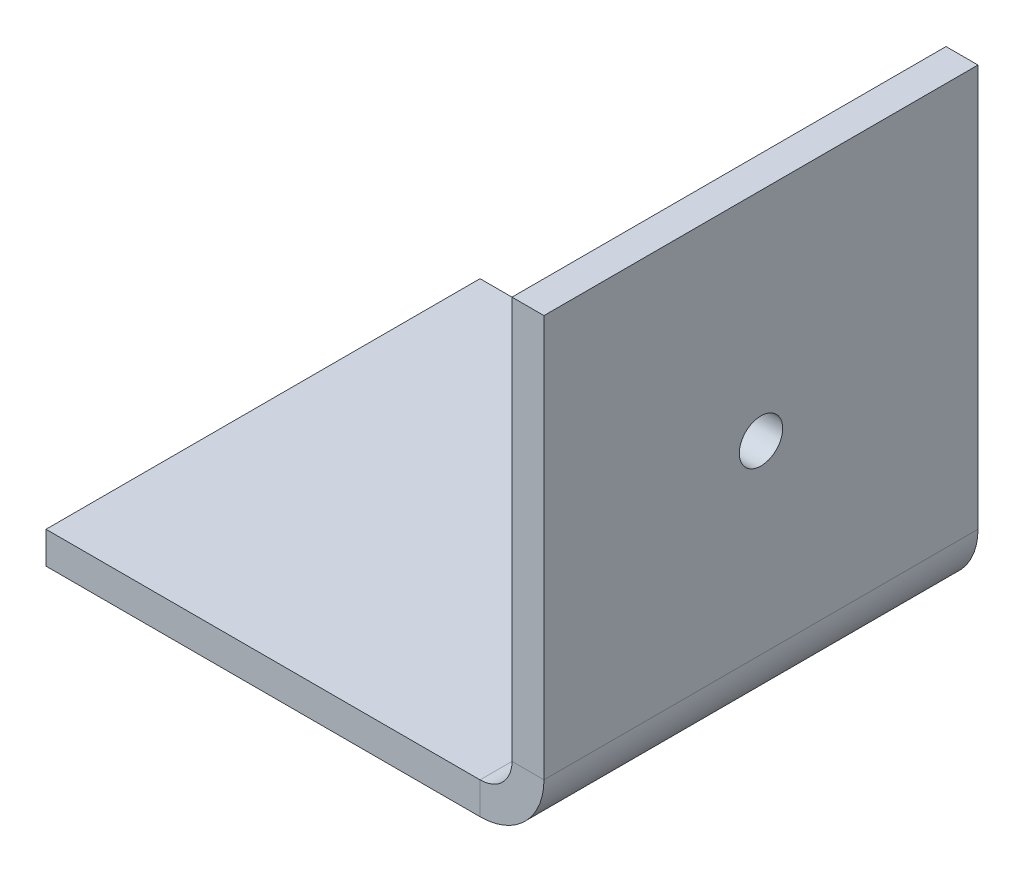
ISO-10303-21;
HEADER;
FILE_DESCRIPTION(('STEP AP214'),'2;1');
FILE_NAME('part.step','',(''),(''),'','','');
FILE_SCHEMA(('AUTOMOTIVE_DESIGN { 1 0 10303 214 1 1 1 1 }'));
ENDSEC;
DATA;
#1=APPLICATION_CONTEXT('core data for automotive mechanical design processes');
#2=APPLICATION_PROTOCOL_DEFINITION('international standard','automotive_design',2000,#1);
#3=PRODUCT_CONTEXT('',#1,'mechanical');
#4=PRODUCT('Part','Part','',(#3));
#5=PRODUCT_RELATED_PRODUCT_CATEGORY('part','',(#4));
#6=PRODUCT_DEFINITION_FORMATION('','',#4);
#7=PRODUCT_DEFINITION_CONTEXT('part definition',#1,'design');
#8=PRODUCT_DEFINITION('design','',#6,#7);
#9=PRODUCT_DEFINITION_SHAPE('','',#8);
#10=(LENGTH_UNIT() NAMED_UNIT(*) SI_UNIT(.MILLI.,.METRE.));
#11=(NAMED_UNIT(*) PLANE_ANGLE_UNIT() SI_UNIT($,.RADIAN.));
#12=(NAMED_UNIT(*) SI_UNIT($,.STERADIAN.) SOLID_ANGLE_UNIT());
#13=UNCERTAINTY_MEASURE_WITH_UNIT(LENGTH_MEASURE(1.E-05),#10,'distance_accuracy_value','');
#14=(GEOMETRIC_REPRESENTATION_CONTEXT(3) GLOBAL_UNCERTAINTY_ASSIGNED_CONTEXT((#13)) GLOBAL_UNIT_ASSIGNED_CONTEXT((#10,
#11,#12)) REPRESENTATION_CONTEXT('',''));
#15=CARTESIAN_POINT('',(0.,0.,0.));
#16=DIRECTION('',(0.,0.,1.));
#17=DIRECTION('',(1.,0.,0.));
#18=AXIS2_PLACEMENT_3D('',#15,#16,#17);
#19=CARTESIAN_POINT('',(-5.,-0.7366,5.));
#20=DIRECTION('',(0.,0.,1.));
#21=DIRECTION('',(1.,0.,0.));
#22=AXIS2_PLACEMENT_3D('',#19,#20,#21);
#23=PLANE('',#22);
#24=DIRECTION('',(1.,0.,0.));
#25=VECTOR('',#24,1.);
#26=CARTESIAN_POINT('',(-5.,0.,5.));
#27=LINE('',#26,#25);
#28=CARTESIAN_POINT('',(-5.,0.,5.));
#29=VERTEX_POINT('',#28);
#30=CARTESIAN_POINT('',(4.99999999999999,0.,5.));
#31=VERTEX_POINT('',#30);
#32=EDGE_CURVE('E192',#29,#31,#27,.T.);
#33=ORIENTED_EDGE('',*,*,#32,.F.);
#34=DIRECTION('',(0.,1.,0.));
#35=VECTOR('',#34,1.);
#36=CARTESIAN_POINT('',(-5.,-0.7366,5.));
#37=LINE('',#36,#35);
#38=CARTESIAN_POINT('',(-5.,-0.7366,5.));
#39=VERTEX_POINT('',#38);
#40=EDGE_CURVE('E67',#39,#29,#37,.T.);
#41=ORIENTED_EDGE('',*,*,#40,.F.);
#42=DIRECTION('',(1.,0.,0.));
#43=VECTOR('',#42,1.);
#44=CARTESIAN_POINT('',(-5.,-0.7366,5.));
#45=LINE('',#44,#43);
#46=CARTESIAN_POINT('',(4.99999999999999,-0.7366,5.));
#47=VERTEX_POINT('',#46);
#48=EDGE_CURVE('E197',#39,#47,#45,.T.);
#49=ORIENTED_EDGE('',*,*,#48,.T.);
#50=DIRECTION('',(0.,1.,0.));
#51=VECTOR('',#50,1.);
#52=CARTESIAN_POINT('',(4.99999999999999,-0.7366,5.));
#53=LINE('',#52,#51);
#54=EDGE_CURVE('E13',#47,#31,#53,.T.);
#55=ORIENTED_EDGE('',*,*,#54,.T.);
#56=EDGE_LOOP('',(#33,#41,#49,#55));
#57=FACE_BOUND('',#56,.T.);
#58=ADVANCED_FACE('F57',(#57),#23,.T.);
#59=CARTESIAN_POINT('',(-5.00000000000001,-0.7366,-5.));
#60=DIRECTION('',(-1.,0.,0.));
#61=DIRECTION('',(0.,0.,1.));
#62=AXIS2_PLACEMENT_3D('',#59,#60,#61);
#63=PLANE('',#62);
#64=DIRECTION('',(0.,0.,1.));
#65=VECTOR('',#64,1.);
#66=CARTESIAN_POINT('',(-5.00000000000001,0.,-5.));
#67=LINE('',#66,#65);
#68=CARTESIAN_POINT('',(-5.00000000000001,0.,-5.));
#69=VERTEX_POINT('',#68);
#70=EDGE_CURVE('E204',#69,#29,#67,.T.);
#71=ORIENTED_EDGE('',*,*,#70,.F.);
#72=DIRECTION('',(0.,1.,0.));
#73=VECTOR('',#72,1.);
#74=CARTESIAN_POINT('',(-5.00000000000001,-0.7366,-5.));
#75=LINE('',#74,#73);
#76=CARTESIAN_POINT('',(-5.00000000000001,-0.7366,-5.));
#77=VERTEX_POINT('',#76);
#78=EDGE_CURVE('E100',#77,#69,#75,.T.);
#79=ORIENTED_EDGE('',*,*,#78,.F.);
#80=DIRECTION('',(0.,0.,1.));
#81=VECTOR('',#80,1.);
#82=CARTESIAN_POINT('',(-5.00000000000001,-0.7366,-5.));
#83=LINE('',#82,#81);
#84=EDGE_CURVE('E195',#77,#39,#83,.T.);
#85=ORIENTED_EDGE('',*,*,#84,.T.);
#86=ORIENTED_EDGE('',*,*,#40,.T.);
#87=EDGE_LOOP('',(#71,#79,#85,#86));
#88=FACE_BOUND('',#87,.T.);
#89=ADVANCED_FACE('F243',(#88),#63,.T.);
#90=CARTESIAN_POINT('',(-5.00000000000001,-0.7366,-5.));
#91=DIRECTION('',(0.,0.,-1.));
#92=DIRECTION('',(-1.,0.,0.));
#93=AXIS2_PLACEMENT_3D('',#90,#91,#92);
#94=PLANE('',#93);
#95=DIRECTION('',(-1.,0.,0.));
#96=VECTOR('',#95,1.);
#97=CARTESIAN_POINT('',(-5.00000000000001,0.,-5.));
#98=LINE('',#97,#96);
#99=CARTESIAN_POINT('',(4.99999999999998,0.,-5.));
#100=VERTEX_POINT('',#99);
#101=EDGE_CURVE('E201',#100,#69,#98,.T.);
#102=ORIENTED_EDGE('',*,*,#101,.F.);
#103=DIRECTION('',(0.,1.,0.));
#104=VECTOR('',#103,1.);
#105=CARTESIAN_POINT('',(4.99999999999998,-0.7366,-5.));
#106=LINE('',#105,#104);
#107=CARTESIAN_POINT('',(4.99999999999998,-0.736600000000003,-5.));
#108=VERTEX_POINT('',#107);
#109=EDGE_CURVE('E61',#108,#100,#106,.T.);
#110=ORIENTED_EDGE('',*,*,#109,.F.);
#111=DIRECTION('',(-1.,0.,0.));
#112=VECTOR('',#111,1.);
#113=CARTESIAN_POINT('',(-5.00000000000001,-0.7366,-5.));
#114=LINE('',#113,#112);
#115=EDGE_CURVE('E191',#108,#77,#114,.T.);
#116=ORIENTED_EDGE('',*,*,#115,.T.);
#117=ORIENTED_EDGE('',*,*,#78,.T.);
#118=EDGE_LOOP('',(#102,#110,#116,#117));
#119=FACE_BOUND('',#118,.T.);
#120=ADVANCED_FACE('F59',(#119),#94,.T.);
#121=CARTESIAN_POINT('',(0.,-0.7366,0.));
#122=DIRECTION('',(0.,1.,0.));
#123=DIRECTION('',(0.,0.,1.));
#124=AXIS2_PLACEMENT_3D('',#121,#122,#123);
#125=PLANE('',#124);
#126=DIRECTION('',(0.,0.,-1.));
#127=VECTOR('',#126,1.);
#128=CARTESIAN_POINT('',(4.99999999999998,-0.7366,-5.));
#129=LINE('',#128,#127);
#130=EDGE_CURVE('E76',#47,#108,#129,.T.);
#131=ORIENTED_EDGE('',*,*,#130,.F.);
#132=ORIENTED_EDGE('',*,*,#48,.F.);
#133=ORIENTED_EDGE('',*,*,#84,.F.);
#134=ORIENTED_EDGE('',*,*,#115,.F.);
#135=EDGE_LOOP('',(#131,#132,#133,#134));
#136=FACE_BOUND('',#135,.T.);
#137=ADVANCED_FACE('F238',(#136),#125,.F.);
#138=CARTESIAN_POINT('',(0.,0.,0.));
#139=DIRECTION('',(0.,1.,0.));
#140=DIRECTION('',(0.,0.,1.));
#141=AXIS2_PLACEMENT_3D('',#138,#139,#140);
#142=PLANE('',#141);
#143=DIRECTION('',(0.,0.,-1.));
#144=VECTOR('',#143,1.);
#145=CARTESIAN_POINT('',(4.99999999999998,0.,-5.));
#146=LINE('',#145,#144);
#147=EDGE_CURVE('E180',#31,#100,#146,.T.);
#148=ORIENTED_EDGE('',*,*,#147,.T.);
#149=ORIENTED_EDGE('',*,*,#101,.T.);
#150=ORIENTED_EDGE('',*,*,#70,.T.);
#151=ORIENTED_EDGE('',*,*,#32,.T.);
#152=EDGE_LOOP('',(#148,#149,#150,#151));
#153=FACE_BOUND('',#152,.T.);
#154=ADVANCED_FACE('F231',(#153),#142,.T.);
#155=CARTESIAN_POINT('',(4.99999999999999,0.7366,5.));
#156=DIRECTION('',(0.,0.,1.));
#157=DIRECTION('',(1.,0.,0.));
#158=AXIS2_PLACEMENT_3D('',#155,#156,#157);
#159=PLANE('',#158);
#160=DIRECTION('',(-1.,0.,0.));
#161=VECTOR('',#160,1.);
#162=CARTESIAN_POINT('',(6.47319999999999,0.736599999999994,5.));
#163=LINE('',#162,#161);
#164=CARTESIAN_POINT('',(5.73659999999999,0.736599999999997,5.));
#165=VERTEX_POINT('',#164);
#166=CARTESIAN_POINT('',(6.47319999999999,0.736599999999994,5.));
#167=VERTEX_POINT('',#166);
#168=EDGE_CURVE('E154',#165,#167,#163,.F.);
#169=ORIENTED_EDGE('',*,*,#168,.F.);
#170=CARTESIAN_POINT('',(4.99999999999999,0.7366,5.));
#171=DIRECTION('',(0.,0.,-1.));
#172=DIRECTION('',(-1.,0.,0.));
#173=AXIS2_PLACEMENT_3D('',#170,#171,#172);
#174=CIRCLE('',#173,0.736600000000003);
#175=EDGE_CURVE('E184',#31,#165,#174,.F.);
#176=ORIENTED_EDGE('',*,*,#175,.F.);
#177=ORIENTED_EDGE('',*,*,#54,.F.);
#178=CARTESIAN_POINT('',(4.99999999999999,0.7366,5.));
#179=DIRECTION('',(0.,0.,-1.));
#180=DIRECTION('',(-1.,0.,0.));
#181=AXIS2_PLACEMENT_3D('',#178,#179,#180);
#182=CIRCLE('',#181,1.4732);
#183=EDGE_CURVE('E177',#47,#167,#182,.F.);
#184=ORIENTED_EDGE('',*,*,#183,.T.);
#185=EDGE_LOOP('',(#169,#176,#177,#184));
#186=FACE_BOUND('',#185,.T.);
#187=ADVANCED_FACE('F229',(#186),#159,.T.);
#188=CARTESIAN_POINT('',(4.99999999999999,0.7366,-5.));
#189=DIRECTION('',(0.,0.,1.));
#190=DIRECTION('',(1.,0.,0.));
#191=AXIS2_PLACEMENT_3D('',#188,#189,#190);
#192=PLANE('',#191);
#193=CARTESIAN_POINT('',(4.99999999999999,0.7366,-5.));
#194=DIRECTION('',(0.,0.,-1.));
#195=DIRECTION('',(-1.,0.,0.));
#196=AXIS2_PLACEMENT_3D('',#193,#194,#195);
#197=CIRCLE('',#196,0.736600000000003);
#198=CARTESIAN_POINT('',(5.73659999999999,0.736599999999997,-5.));
#199=VERTEX_POINT('',#198);
#200=EDGE_CURVE('E187',#199,#100,#197,.T.);
#201=ORIENTED_EDGE('',*,*,#200,.F.);
#202=DIRECTION('',(-1.,0.,0.));
#203=VECTOR('',#202,1.);
#204=CARTESIAN_POINT('',(5.73659999999998,0.736599999999997,-5.));
#205=LINE('',#204,#203);
#206=CARTESIAN_POINT('',(6.47319999999998,0.736599999999994,-5.));
#207=VERTEX_POINT('',#206);
#208=EDGE_CURVE('E171',#199,#207,#205,.F.);
#209=ORIENTED_EDGE('',*,*,#208,.T.);
#210=CARTESIAN_POINT('',(4.99999999999999,0.7366,-5.));
#211=DIRECTION('',(0.,0.,-1.));
#212=DIRECTION('',(-1.,0.,0.));
#213=AXIS2_PLACEMENT_3D('',#210,#211,#212);
#214=CIRCLE('',#213,1.4732);
#215=EDGE_CURVE('E181',#207,#108,#214,.T.);
#216=ORIENTED_EDGE('',*,*,#215,.T.);
#217=ORIENTED_EDGE('',*,*,#109,.T.);
#218=EDGE_LOOP('',(#201,#209,#216,#217));
#219=FACE_BOUND('',#218,.T.);
#220=ADVANCED_FACE('F212',(#219),#192,.F.);
#221=CARTESIAN_POINT('',(4.99999999999999,0.7366,-5.));
#222=DIRECTION('',(0.,0.,-1.));
#223=DIRECTION('',(1.,0.,0.));
#224=AXIS2_PLACEMENT_3D('',#221,#222,#223);
#225=CYLINDRICAL_SURFACE('',#224,1.4732);
#226=ORIENTED_EDGE('',*,*,#130,.T.);
#227=ORIENTED_EDGE('',*,*,#215,.F.);
#228=DIRECTION('',(0.,0.,-1.));
#229=VECTOR('',#228,1.);
#230=CARTESIAN_POINT('',(6.47319999999999,0.736599999999994,5.));
#231=LINE('',#230,#229);
#232=EDGE_CURVE('E169',#207,#167,#231,.F.);
#233=ORIENTED_EDGE('',*,*,#232,.T.);
#234=ORIENTED_EDGE('',*,*,#183,.F.);
#235=EDGE_LOOP('',(#226,#227,#233,#234));
#236=FACE_BOUND('',#235,.T.);
#237=ADVANCED_FACE('F227',(#236),#225,.T.);
#238=CARTESIAN_POINT('',(4.99999999999999,0.7366,-5.));
#239=DIRECTION('',(0.,0.,-1.));
#240=DIRECTION('',(1.,0.,0.));
#241=AXIS2_PLACEMENT_3D('',#238,#239,#240);
#242=CYLINDRICAL_SURFACE('',#241,0.736600000000003);
#243=ORIENTED_EDGE('',*,*,#147,.F.);
#244=ORIENTED_EDGE('',*,*,#175,.T.);
#245=DIRECTION('',(0.,0.,-1.));
#246=VECTOR('',#245,1.);
#247=CARTESIAN_POINT('',(5.73659999999999,0.736599999999997,5.));
#248=LINE('',#247,#246);
#249=EDGE_CURVE('E174',#165,#199,#248,.T.);
#250=ORIENTED_EDGE('',*,*,#249,.T.);
#251=ORIENTED_EDGE('',*,*,#200,.T.);
#252=EDGE_LOOP('',(#243,#244,#250,#251));
#253=FACE_BOUND('',#252,.T.);
#254=ADVANCED_FACE('F216',(#253),#242,.F.);
#255=CARTESIAN_POINT('',(6.47319999999998,0.,0.));
#256=DIRECTION('',(-1.,0.,0.));
#257=DIRECTION('',(0.,-1.,0.));
#258=AXIS2_PLACEMENT_3D('',#255,#256,#257);
#259=PLANE('',#258);
#260=CARTESIAN_POINT('',(6.4732,5.,0.));
#261=DIRECTION('',(-1.,0.,0.));
#262=DIRECTION('',(0.,-1.,0.));
#263=AXIS2_PLACEMENT_3D('',#260,#261,#262);
#264=CIRCLE('',#263,0.5);
#265=CARTESIAN_POINT('',(6.4732,4.5,0.));
#266=VERTEX_POINT('',#265);
#267=EDGE_CURVE('E163',#266,#266,#264,.F.);
#268=ORIENTED_EDGE('',*,*,#267,.F.);
#269=EDGE_LOOP('',(#268));
#270=FACE_BOUND('',#269,.T.);
#271=ORIENTED_EDGE('',*,*,#232,.F.);
#272=DIRECTION('',(0.,1.,0.));
#273=VECTOR('',#272,1.);
#274=CARTESIAN_POINT('',(6.47319999999998,0.,-5.));
#275=LINE('',#274,#273);
#276=CARTESIAN_POINT('',(6.47320000000002,10.,-5.));
#277=VERTEX_POINT('',#276);
#278=EDGE_CURVE('E137',#207,#277,#275,.T.);
#279=ORIENTED_EDGE('',*,*,#278,.T.);
#280=DIRECTION('',(0.,0.,1.));
#281=VECTOR('',#280,1.);
#282=CARTESIAN_POINT('',(6.47320000000002,10.,0.));
#283=LINE('',#282,#281);
#284=CARTESIAN_POINT('',(6.47320000000002,10.,5.));
#285=VERTEX_POINT('',#284);
#286=EDGE_CURVE('E130',#277,#285,#283,.T.);
#287=ORIENTED_EDGE('',*,*,#286,.T.);
#288=DIRECTION('',(0.,-1.,0.));
#289=VECTOR('',#288,1.);
#290=CARTESIAN_POINT('',(6.47319999999999,0.,5.));
#291=LINE('',#290,#289);
#292=EDGE_CURVE('E135',#285,#167,#291,.T.);
#293=ORIENTED_EDGE('',*,*,#292,.T.);
#294=EDGE_LOOP('',(#271,#279,#287,#293));
#295=FACE_BOUND('',#294,.T.);
#296=ADVANCED_FACE('F133',(#270,#295),#259,.F.);
#297=CARTESIAN_POINT('',(5.73659999999998,0.,0.));
#298=DIRECTION('',(-1.,0.,0.));
#299=DIRECTION('',(0.,-1.,0.));
#300=AXIS2_PLACEMENT_3D('',#297,#298,#299);
#301=PLANE('',#300);
#302=CARTESIAN_POINT('',(5.7366,5.,0.));
#303=DIRECTION('',(-1.,0.,0.));
#304=DIRECTION('',(0.,-1.,0.));
#305=AXIS2_PLACEMENT_3D('',#302,#303,#304);
#306=CIRCLE('',#305,0.5);
#307=CARTESIAN_POINT('',(5.7366,4.5,0.));
#308=VERTEX_POINT('',#307);
#309=EDGE_CURVE('E166',#308,#308,#306,.F.);
#310=ORIENTED_EDGE('',*,*,#309,.T.);
#311=EDGE_LOOP('',(#310));
#312=FACE_BOUND('',#311,.T.);
#313=DIRECTION('',(0.,-1.,0.));
#314=VECTOR('',#313,1.);
#315=CARTESIAN_POINT('',(5.73660000000002,10.,-5.));
#316=LINE('',#315,#314);
#317=CARTESIAN_POINT('',(5.73660000000002,10.,-5.));
#318=VERTEX_POINT('',#317);
#319=EDGE_CURVE('E157',#199,#318,#316,.F.);
#320=ORIENTED_EDGE('',*,*,#319,.F.);
#321=ORIENTED_EDGE('',*,*,#249,.F.);
#322=DIRECTION('',(0.,1.,0.));
#323=VECTOR('',#322,1.);
#324=CARTESIAN_POINT('',(5.73659999999999,0.,5.));
#325=LINE('',#324,#323);
#326=CARTESIAN_POINT('',(5.73660000000002,10.,5.));
#327=VERTEX_POINT('',#326);
#328=EDGE_CURVE('E161',#327,#165,#325,.F.);
#329=ORIENTED_EDGE('',*,*,#328,.F.);
#330=DIRECTION('',(0.,0.,-1.));
#331=VECTOR('',#330,1.);
#332=CARTESIAN_POINT('',(5.73660000000002,10.,5.));
#333=LINE('',#332,#331);
#334=EDGE_CURVE('E146',#318,#327,#333,.F.);
#335=ORIENTED_EDGE('',*,*,#334,.F.);
#336=EDGE_LOOP('',(#320,#321,#329,#335));
#337=FACE_BOUND('',#336,.T.);
#338=ADVANCED_FACE('F221',(#312,#337),#301,.T.);
#339=CARTESIAN_POINT('',(6.47319999999999,0.,5.));
#340=DIRECTION('',(0.,0.,-1.));
#341=DIRECTION('',(-1.,0.,0.));
#342=AXIS2_PLACEMENT_3D('',#339,#340,#341);
#343=PLANE('',#342);
#344=ORIENTED_EDGE('',*,*,#168,.T.);
#345=ORIENTED_EDGE('',*,*,#292,.F.);
#346=DIRECTION('',(-1.,0.,0.));
#347=VECTOR('',#346,1.);
#348=CARTESIAN_POINT('',(6.47320000000002,10.,5.));
#349=LINE('',#348,#347);
#350=EDGE_CURVE('E141',#285,#327,#349,.T.);
#351=ORIENTED_EDGE('',*,*,#350,.T.);
#352=ORIENTED_EDGE('',*,*,#328,.T.);
#353=EDGE_LOOP('',(#344,#345,#351,#352));
#354=FACE_BOUND('',#353,.T.);
#355=ADVANCED_FACE('F153',(#354),#343,.F.);
#356=CARTESIAN_POINT('',(6.47320000000002,10.,-5.));
#357=DIRECTION('',(0.,0.,1.));
#358=DIRECTION('',(1.,0.,0.));
#359=AXIS2_PLACEMENT_3D('',#356,#357,#358);
#360=PLANE('',#359);
#361=ORIENTED_EDGE('',*,*,#208,.F.);
#362=ORIENTED_EDGE('',*,*,#319,.T.);
#363=DIRECTION('',(-1.,0.,0.));
#364=VECTOR('',#363,1.);
#365=CARTESIAN_POINT('',(6.47320000000002,10.,-5.));
#366=LINE('',#365,#364);
#367=EDGE_CURVE('E150',#277,#318,#366,.T.);
#368=ORIENTED_EDGE('',*,*,#367,.F.);
#369=ORIENTED_EDGE('',*,*,#278,.F.);
#370=EDGE_LOOP('',(#361,#362,#368,#369));
#371=FACE_BOUND('',#370,.T.);
#372=ADVANCED_FACE('F223',(#371),#360,.F.);
#373=CARTESIAN_POINT('',(6.47320000000002,10.,5.));
#374=DIRECTION('',(0.,-1.,0.));
#375=DIRECTION('',(1.,0.,0.));
#376=AXIS2_PLACEMENT_3D('',#373,#374,#375);
#377=PLANE('',#376);
#378=ORIENTED_EDGE('',*,*,#334,.T.);
#379=ORIENTED_EDGE('',*,*,#350,.F.);
#380=ORIENTED_EDGE('',*,*,#286,.F.);
#381=ORIENTED_EDGE('',*,*,#367,.T.);
#382=EDGE_LOOP('',(#378,#379,#380,#381));
#383=FACE_BOUND('',#382,.T.);
#384=ADVANCED_FACE('F144',(#383),#377,.F.);
#385=CARTESIAN_POINT('',(6.4732,5.,0.));
#386=DIRECTION('',(-1.,0.,0.));
#387=DIRECTION('',(0.,-1.,0.));
#388=AXIS2_PLACEMENT_3D('',#385,#386,#387);
#389=CYLINDRICAL_SURFACE('',#388,0.5);
#390=ORIENTED_EDGE('',*,*,#267,.T.);
#391=EDGE_LOOP('',(#390));
#392=FACE_BOUND('',#391,.T.);
#393=ORIENTED_EDGE('',*,*,#309,.F.);
#394=EDGE_LOOP('',(#393));
#395=FACE_BOUND('',#394,.T.);
#396=ADVANCED_FACE('F351',(#392,#395),#389,.F.);
#397=CLOSED_SHELL('',(#58,#89,#120,#137,#154,#187,#220,#237,#254,#296,#338,#355,#372,#384,#396));
#398=MANIFOLD_SOLID_BREP('B2',#397);
#399=ADVANCED_BREP_SHAPE_REPRESENTATION('',(#18,#398),#14);
#400=SHAPE_DEFINITION_REPRESENTATION(#9,#399);
ENDSEC;
END-ISO-10303-21;
